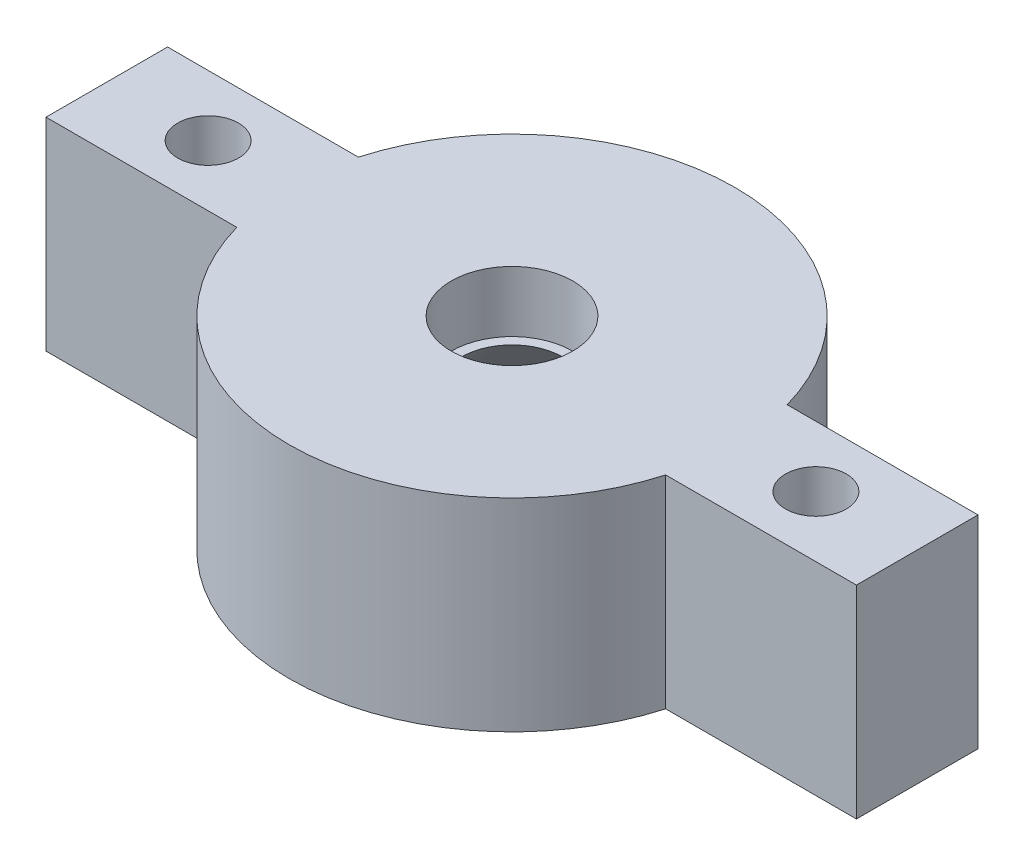
ISO-10303-21;
HEADER;
FILE_DESCRIPTION(('STEP AP214'),'2;1');
FILE_NAME('part.step','',(''),(''),'','','');
FILE_SCHEMA(('AUTOMOTIVE_DESIGN { 1 0 10303 214 1 1 1 1 }'));
ENDSEC;
DATA;
#1=APPLICATION_CONTEXT('core data for automotive mechanical design processes');
#2=APPLICATION_PROTOCOL_DEFINITION('international standard','automotive_design',2000,#1);
#3=PRODUCT_CONTEXT('',#1,'mechanical');
#4=PRODUCT('Part','Part','',(#3));
#5=PRODUCT_RELATED_PRODUCT_CATEGORY('part','',(#4));
#6=PRODUCT_DEFINITION_FORMATION('','',#4);
#7=PRODUCT_DEFINITION_CONTEXT('part definition',#1,'design');
#8=PRODUCT_DEFINITION('design','',#6,#7);
#9=PRODUCT_DEFINITION_SHAPE('','',#8);
#10=(LENGTH_UNIT() NAMED_UNIT(*) SI_UNIT(.MILLI.,.METRE.));
#11=(NAMED_UNIT(*) PLANE_ANGLE_UNIT() SI_UNIT($,.RADIAN.));
#12=(NAMED_UNIT(*) SI_UNIT($,.STERADIAN.) SOLID_ANGLE_UNIT());
#13=UNCERTAINTY_MEASURE_WITH_UNIT(LENGTH_MEASURE(1.E-05),#10,'distance_accuracy_value','');
#14=(GEOMETRIC_REPRESENTATION_CONTEXT(3) GLOBAL_UNCERTAINTY_ASSIGNED_CONTEXT((#13)) GLOBAL_UNIT_ASSIGNED_CONTEXT((#10,
#11,#12)) REPRESENTATION_CONTEXT('',''));
#15=CARTESIAN_POINT('',(0.,0.,0.));
#16=DIRECTION('',(0.,0.,1.));
#17=DIRECTION('',(1.,0.,0.));
#18=AXIS2_PLACEMENT_3D('',#15,#16,#17);
#19=CARTESIAN_POINT('',(40.,-5.,-3.));
#20=DIRECTION('',(0.,0.,1.));
#21=DIRECTION('',(1.,0.,0.));
#22=AXIS2_PLACEMENT_3D('',#19,#20,#21);
#23=PLANE('',#22);
#24=DIRECTION('',(-1.,0.,0.));
#25=VECTOR('',#24,1.);
#26=CARTESIAN_POINT('',(40.,-5.,-3.));
#27=LINE('',#26,#25);
#28=CARTESIAN_POINT('',(40.,-5.,-3.));
#29=VERTEX_POINT('',#28);
#30=CARTESIAN_POINT('',(30.5830052442584,-5.,-3.));
#31=VERTEX_POINT('',#30);
#32=EDGE_CURVE('E116',#29,#31,#27,.T.);
#33=ORIENTED_EDGE('',*,*,#32,.T.);
#34=DIRECTION('',(0.,1.,0.));
#35=VECTOR('',#34,1.);
#36=CARTESIAN_POINT('',(30.5830052442584,-36.1126983722081,-3.));
#37=LINE('',#36,#35);
#38=CARTESIAN_POINT('',(30.5830052442584,5.,-3.));
#39=VERTEX_POINT('',#38);
#40=EDGE_CURVE('E64',#31,#39,#37,.T.);
#41=ORIENTED_EDGE('',*,*,#40,.T.);
#42=DIRECTION('',(-1.,0.,0.));
#43=VECTOR('',#42,1.);
#44=CARTESIAN_POINT('',(40.,5.,-3.));
#45=LINE('',#44,#43);
#46=CARTESIAN_POINT('',(40.,5.,-3.));
#47=VERTEX_POINT('',#46);
#48=EDGE_CURVE('E49',#47,#39,#45,.T.);
#49=ORIENTED_EDGE('',*,*,#48,.F.);
#50=DIRECTION('',(0.,1.,0.));
#51=VECTOR('',#50,1.);
#52=CARTESIAN_POINT('',(40.,-5.,-3.));
#53=LINE('',#52,#51);
#54=EDGE_CURVE('E141',#29,#47,#53,.T.);
#55=ORIENTED_EDGE('',*,*,#54,.F.);
#56=EDGE_LOOP('',(#33,#41,#49,#55));
#57=FACE_BOUND('',#56,.T.);
#58=ADVANCED_FACE('F41',(#57),#23,.F.);
#59=CARTESIAN_POINT('',(40.,-5.,3.));
#60=DIRECTION('',(0.,0.,-1.));
#61=DIRECTION('',(-1.,0.,0.));
#62=AXIS2_PLACEMENT_3D('',#59,#60,#61);
#63=PLANE('',#62);
#64=DIRECTION('',(-1.,0.,0.));
#65=VECTOR('',#64,1.);
#66=CARTESIAN_POINT('',(40.,-5.,3.));
#67=LINE('',#66,#65);
#68=CARTESIAN_POINT('',(9.41699475574164,-5.,3.));
#69=VERTEX_POINT('',#68);
#70=CARTESIAN_POINT('',(0.,-5.,3.));
#71=VERTEX_POINT('',#70);
#72=EDGE_CURVE('E157',#69,#71,#67,.T.);
#73=ORIENTED_EDGE('',*,*,#72,.F.);
#74=DIRECTION('',(0.,1.,0.));
#75=VECTOR('',#74,1.);
#76=CARTESIAN_POINT('',(9.41699475574164,-36.1126983722081,3.));
#77=LINE('',#76,#75);
#78=CARTESIAN_POINT('',(9.41699475574164,5.,3.));
#79=VERTEX_POINT('',#78);
#80=EDGE_CURVE('E124',#69,#79,#77,.T.);
#81=ORIENTED_EDGE('',*,*,#80,.T.);
#82=DIRECTION('',(-1.,0.,0.));
#83=VECTOR('',#82,1.);
#84=CARTESIAN_POINT('',(40.,5.,3.));
#85=LINE('',#84,#83);
#86=CARTESIAN_POINT('',(0.,5.,3.));
#87=VERTEX_POINT('',#86);
#88=EDGE_CURVE('E161',#79,#87,#85,.T.);
#89=ORIENTED_EDGE('',*,*,#88,.T.);
#90=DIRECTION('',(0.,-1.,0.));
#91=VECTOR('',#90,1.);
#92=CARTESIAN_POINT('',(0.,-5.,3.));
#93=LINE('',#92,#91);
#94=EDGE_CURVE('E153',#87,#71,#93,.T.);
#95=ORIENTED_EDGE('',*,*,#94,.T.);
#96=EDGE_LOOP('',(#73,#81,#89,#95));
#97=FACE_BOUND('',#96,.T.);
#98=ADVANCED_FACE('F207',(#97),#63,.F.);
#99=CARTESIAN_POINT('',(9.41699475574164,5.,-3.));
#100=VERTEX_POINT('',#99);
#101=CARTESIAN_POINT('',(0.,5.,-3.));
#102=VERTEX_POINT('',#101);
#103=EDGE_CURVE('E56',#100,#102,#45,.T.);
#104=ORIENTED_EDGE('',*,*,#103,.F.);
#105=DIRECTION('',(0.,1.,0.));
#106=VECTOR('',#105,1.);
#107=CARTESIAN_POINT('',(9.41699475574164,-36.1126983722081,-3.));
#108=LINE('',#107,#106);
#109=CARTESIAN_POINT('',(9.41699475574164,-5.,-3.));
#110=VERTEX_POINT('',#109);
#111=EDGE_CURVE('E119',#100,#110,#108,.F.);
#112=ORIENTED_EDGE('',*,*,#111,.T.);
#113=CARTESIAN_POINT('',(0.,-5.,-3.));
#114=VERTEX_POINT('',#113);
#115=EDGE_CURVE('E108',#110,#114,#27,.T.);
#116=ORIENTED_EDGE('',*,*,#115,.T.);
#117=DIRECTION('',(0.,1.,0.));
#118=VECTOR('',#117,1.);
#119=CARTESIAN_POINT('',(0.,-5.,-3.));
#120=LINE('',#119,#118);
#121=EDGE_CURVE('E140',#114,#102,#120,.T.);
#122=ORIENTED_EDGE('',*,*,#121,.T.);
#123=EDGE_LOOP('',(#104,#112,#116,#122));
#124=FACE_BOUND('',#123,.T.);
#125=ADVANCED_FACE('F120',(#124),#23,.F.);
#126=CARTESIAN_POINT('',(40.,5.,3.));
#127=DIRECTION('',(0.,-1.,0.));
#128=DIRECTION('',(0.,0.,-1.));
#129=AXIS2_PLACEMENT_3D('',#126,#127,#128);
#130=PLANE('',#129);
#131=CARTESIAN_POINT('',(5.,5.,0.));
#132=DIRECTION('',(0.,-1.,0.));
#133=DIRECTION('',(0.,0.,-1.));
#134=AXIS2_PLACEMENT_3D('',#131,#132,#133);
#135=CIRCLE('',#134,1.5);
#136=CARTESIAN_POINT('',(5.,5.,-1.5));
#137=VERTEX_POINT('',#136);
#138=EDGE_CURVE('E175',#137,#137,#135,.F.);
#139=ORIENTED_EDGE('',*,*,#138,.F.);
#140=EDGE_LOOP('',(#139));
#141=FACE_BOUND('',#140,.T.);
#142=CARTESIAN_POINT('',(35.,5.,0.));
#143=DIRECTION('',(0.,-1.,0.));
#144=DIRECTION('',(0.,0.,-1.));
#145=AXIS2_PLACEMENT_3D('',#142,#143,#144);
#146=CIRCLE('',#145,1.49999999999999);
#147=CARTESIAN_POINT('',(35.,5.,-1.49999999999999));
#148=VERTEX_POINT('',#147);
#149=EDGE_CURVE('E428',#148,#148,#146,.F.);
#150=ORIENTED_EDGE('',*,*,#149,.F.);
#151=EDGE_LOOP('',(#150));
#152=FACE_BOUND('',#151,.T.);
#153=CARTESIAN_POINT('',(20.,5.,0.));
#154=DIRECTION('',(0.,-1.,0.));
#155=DIRECTION('',(0.,0.,-1.));
#156=AXIS2_PLACEMENT_3D('',#153,#154,#155);
#157=CIRCLE('',#156,3.);
#158=CARTESIAN_POINT('',(20.,5.,-3.));
#159=VERTEX_POINT('',#158);
#160=EDGE_CURVE('E165',#159,#159,#157,.T.);
#161=ORIENTED_EDGE('',*,*,#160,.T.);
#162=EDGE_LOOP('',(#161));
#163=FACE_BOUND('',#162,.T.);
#164=ORIENTED_EDGE('',*,*,#88,.F.);
#165=CARTESIAN_POINT('',(20.,5.,0.));
#166=DIRECTION('',(0.,1.,0.));
#167=DIRECTION('',(0.,0.,1.));
#168=AXIS2_PLACEMENT_3D('',#165,#166,#167);
#169=CIRCLE('',#168,11.);
#170=CARTESIAN_POINT('',(30.5830052442584,5.,3.));
#171=VERTEX_POINT('',#170);
#172=EDGE_CURVE('E134',#79,#171,#169,.T.);
#173=ORIENTED_EDGE('',*,*,#172,.T.);
#174=CARTESIAN_POINT('',(40.,5.,3.));
#175=VERTEX_POINT('',#174);
#176=EDGE_CURVE('E162',#175,#171,#85,.T.);
#177=ORIENTED_EDGE('',*,*,#176,.F.);
#178=DIRECTION('',(0.,0.,1.));
#179=VECTOR('',#178,1.);
#180=CARTESIAN_POINT('',(40.,5.,3.));
#181=LINE('',#180,#179);
#182=EDGE_CURVE('E144',#47,#175,#181,.T.);
#183=ORIENTED_EDGE('',*,*,#182,.F.);
#184=ORIENTED_EDGE('',*,*,#48,.T.);
#185=EDGE_CURVE('E132',#39,#100,#169,.T.);
#186=ORIENTED_EDGE('',*,*,#185,.T.);
#187=ORIENTED_EDGE('',*,*,#103,.T.);
#188=DIRECTION('',(0.,0.,1.));
#189=VECTOR('',#188,1.);
#190=CARTESIAN_POINT('',(0.,5.,3.));
#191=LINE('',#190,#189);
#192=EDGE_CURVE('E150',#102,#87,#191,.T.);
#193=ORIENTED_EDGE('',*,*,#192,.T.);
#194=EDGE_LOOP('',(#164,#173,#177,#183,#184,#186,#187,#193));
#195=FACE_BOUND('',#194,.T.);
#196=ADVANCED_FACE('F192',(#141,#152,#163,#195),#130,.F.);
#197=ORIENTED_EDGE('',*,*,#176,.T.);
#198=DIRECTION('',(0.,1.,0.));
#199=VECTOR('',#198,1.);
#200=CARTESIAN_POINT('',(30.5830052442584,-36.1126983722081,3.));
#201=LINE('',#200,#199);
#202=CARTESIAN_POINT('',(30.5830052442584,-5.,3.));
#203=VERTEX_POINT('',#202);
#204=EDGE_CURVE('E127',#171,#203,#201,.F.);
#205=ORIENTED_EDGE('',*,*,#204,.T.);
#206=CARTESIAN_POINT('',(40.,-5.,3.));
#207=VERTEX_POINT('',#206);
#208=EDGE_CURVE('E158',#207,#203,#67,.T.);
#209=ORIENTED_EDGE('',*,*,#208,.F.);
#210=DIRECTION('',(0.,-1.,0.));
#211=VECTOR('',#210,1.);
#212=CARTESIAN_POINT('',(40.,-5.,3.));
#213=LINE('',#212,#211);
#214=EDGE_CURVE('E146',#175,#207,#213,.T.);
#215=ORIENTED_EDGE('',*,*,#214,.F.);
#216=EDGE_LOOP('',(#197,#205,#209,#215));
#217=FACE_BOUND('',#216,.T.);
#218=ADVANCED_FACE('F202',(#217),#63,.F.);
#219=CARTESIAN_POINT('',(40.,-5.,3.));
#220=DIRECTION('',(0.,1.,0.));
#221=DIRECTION('',(0.,0.,1.));
#222=AXIS2_PLACEMENT_3D('',#219,#220,#221);
#223=PLANE('',#222);
#224=CARTESIAN_POINT('',(5.,-5.,0.));
#225=DIRECTION('',(0.,-1.,0.));
#226=DIRECTION('',(0.,0.,-1.));
#227=AXIS2_PLACEMENT_3D('',#224,#225,#226);
#228=CIRCLE('',#227,1.5);
#229=CARTESIAN_POINT('',(5.,-5.,-1.5));
#230=VERTEX_POINT('',#229);
#231=EDGE_CURVE('E180',#230,#230,#228,.T.);
#232=ORIENTED_EDGE('',*,*,#231,.F.);
#233=EDGE_LOOP('',(#232));
#234=FACE_BOUND('',#233,.T.);
#235=CARTESIAN_POINT('',(35.,-5.,0.));
#236=DIRECTION('',(0.,-1.,0.));
#237=DIRECTION('',(0.,0.,1.));
#238=AXIS2_PLACEMENT_3D('',#235,#236,#237);
#239=CIRCLE('',#238,1.49999999999999);
#240=CARTESIAN_POINT('',(35.,-5.,1.49999999999999));
#241=VERTEX_POINT('',#240);
#242=EDGE_CURVE('E183',#241,#241,#239,.T.);
#243=ORIENTED_EDGE('',*,*,#242,.F.);
#244=EDGE_LOOP('',(#243));
#245=FACE_BOUND('',#244,.T.);
#246=CARTESIAN_POINT('',(20.,-5.,0.));
#247=DIRECTION('',(0.,1.,0.));
#248=DIRECTION('',(0.,0.,1.));
#249=AXIS2_PLACEMENT_3D('',#246,#247,#248);
#250=CIRCLE('',#249,9.5);
#251=CARTESIAN_POINT('',(20.,-5.,9.5));
#252=VERTEX_POINT('',#251);
#253=EDGE_CURVE('E12',#252,#252,#250,.T.);
#254=ORIENTED_EDGE('',*,*,#253,.T.);
#255=EDGE_LOOP('',(#254));
#256=FACE_BOUND('',#255,.T.);
#257=ORIENTED_EDGE('',*,*,#115,.F.);
#258=CARTESIAN_POINT('',(20.,-5.,0.));
#259=DIRECTION('',(0.,1.,0.));
#260=DIRECTION('',(0.,0.,1.));
#261=AXIS2_PLACEMENT_3D('',#258,#259,#260);
#262=CIRCLE('',#261,11.);
#263=EDGE_CURVE('E112',#110,#31,#262,.F.);
#264=ORIENTED_EDGE('',*,*,#263,.T.);
#265=ORIENTED_EDGE('',*,*,#32,.F.);
#266=DIRECTION('',(0.,0.,-1.));
#267=VECTOR('',#266,1.);
#268=CARTESIAN_POINT('',(40.,-5.,3.));
#269=LINE('',#268,#267);
#270=EDGE_CURVE('E117',#207,#29,#269,.T.);
#271=ORIENTED_EDGE('',*,*,#270,.F.);
#272=ORIENTED_EDGE('',*,*,#208,.T.);
#273=EDGE_CURVE('E128',#203,#69,#262,.F.);
#274=ORIENTED_EDGE('',*,*,#273,.T.);
#275=ORIENTED_EDGE('',*,*,#72,.T.);
#276=DIRECTION('',(0.,0.,-1.));
#277=VECTOR('',#276,1.);
#278=CARTESIAN_POINT('',(0.,-5.,3.));
#279=LINE('',#278,#277);
#280=EDGE_CURVE('E114',#71,#114,#279,.T.);
#281=ORIENTED_EDGE('',*,*,#280,.T.);
#282=EDGE_LOOP('',(#257,#264,#265,#271,#272,#274,#275,#281));
#283=FACE_BOUND('',#282,.T.);
#284=ADVANCED_FACE('F109',(#234,#245,#256,#283),#223,.F.);
#285=CARTESIAN_POINT('',(40.,0.,0.));
#286=DIRECTION('',(-1.,0.,0.));
#287=DIRECTION('',(0.,0.,1.));
#288=AXIS2_PLACEMENT_3D('',#285,#286,#287);
#289=PLANE('',#288);
#290=ORIENTED_EDGE('',*,*,#54,.T.);
#291=ORIENTED_EDGE('',*,*,#182,.T.);
#292=ORIENTED_EDGE('',*,*,#214,.T.);
#293=ORIENTED_EDGE('',*,*,#270,.T.);
#294=EDGE_LOOP('',(#290,#291,#292,#293));
#295=FACE_BOUND('',#294,.T.);
#296=ADVANCED_FACE('F196',(#295),#289,.F.);
#297=CARTESIAN_POINT('',(0.,0.,0.));
#298=DIRECTION('',(-1.,0.,0.));
#299=DIRECTION('',(0.,0.,1.));
#300=AXIS2_PLACEMENT_3D('',#297,#298,#299);
#301=PLANE('',#300);
#302=ORIENTED_EDGE('',*,*,#121,.F.);
#303=ORIENTED_EDGE('',*,*,#280,.F.);
#304=ORIENTED_EDGE('',*,*,#94,.F.);
#305=ORIENTED_EDGE('',*,*,#192,.F.);
#306=EDGE_LOOP('',(#302,#303,#304,#305));
#307=FACE_BOUND('',#306,.T.);
#308=ADVANCED_FACE('F210',(#307),#301,.T.);
#309=CARTESIAN_POINT('',(20.,-36.1126983722081,0.));
#310=DIRECTION('',(0.,1.,0.));
#311=DIRECTION('',(0.,0.,1.));
#312=AXIS2_PLACEMENT_3D('',#309,#310,#311);
#313=CYLINDRICAL_SURFACE('',#312,11.);
#314=ORIENTED_EDGE('',*,*,#80,.F.);
#315=ORIENTED_EDGE('',*,*,#273,.F.);
#316=ORIENTED_EDGE('',*,*,#204,.F.);
#317=ORIENTED_EDGE('',*,*,#172,.F.);
#318=EDGE_LOOP('',(#314,#315,#316,#317));
#319=FACE_BOUND('',#318,.T.);
#320=ADVANCED_FACE('F204',(#319),#313,.T.);
#321=ORIENTED_EDGE('',*,*,#40,.F.);
#322=ORIENTED_EDGE('',*,*,#263,.F.);
#323=ORIENTED_EDGE('',*,*,#111,.F.);
#324=ORIENTED_EDGE('',*,*,#185,.F.);
#325=EDGE_LOOP('',(#321,#322,#323,#324));
#326=FACE_BOUND('',#325,.T.);
#327=ADVANCED_FACE('F126',(#326),#313,.T.);
#328=CARTESIAN_POINT('',(20.,2.,0.));
#329=DIRECTION('',(0.,-1.,0.));
#330=DIRECTION('',(0.,0.,-1.));
#331=AXIS2_PLACEMENT_3D('',#328,#329,#330);
#332=CONICAL_SURFACE('',#331,2.5,0.785398163397448);
#333=CARTESIAN_POINT('',(20.,-3.00000000000001,0.));
#334=DIRECTION('',(0.,1.,0.));
#335=DIRECTION('',(0.,0.,1.));
#336=AXIS2_PLACEMENT_3D('',#333,#334,#335);
#337=CIRCLE('',#336,7.5);
#338=CARTESIAN_POINT('',(20.,-3.00000000000001,-7.5));
#339=VERTEX_POINT('',#338);
#340=EDGE_CURVE('E172',#339,#339,#337,.T.);
#341=CARTESIAN_POINT('',(20.,2.,0.));
#342=DIRECTION('',(0.,1.,0.));
#343=DIRECTION('',(0.,0.,1.));
#344=AXIS2_PLACEMENT_3D('',#341,#342,#343);
#345=CIRCLE('',#344,2.5);
#346=CARTESIAN_POINT('',(20.,2.,-2.5));
#347=VERTEX_POINT('',#346);
#348=EDGE_CURVE('E167',#347,#347,#345,.T.);
#349=CARTESIAN_POINT('',(20.,-3.00000000000001,-7.5));
#350=CARTESIAN_POINT('',(20.,-2.94791666666667,-7.44791666666666));
#351=CARTESIAN_POINT('',(20.,-2.89583333333334,-7.39583333333333));
#352=CARTESIAN_POINT('',(20.,-2.79166666666667,-7.29166666666666));
#353=CARTESIAN_POINT('',(20.,-2.73958333333334,-7.23958333333333));
#354=CARTESIAN_POINT('',(20.,-2.63541666666667,-7.13541666666666));
#355=CARTESIAN_POINT('',(20.,-2.58333333333334,-7.08333333333333));
#356=CARTESIAN_POINT('',(20.,-2.47916666666667,-6.97916666666666));
#357=CARTESIAN_POINT('',(20.,-2.42708333333334,-6.92708333333333));
#358=CARTESIAN_POINT('',(20.,-2.32291666666667,-6.82291666666666));
#359=CARTESIAN_POINT('',(20.,-2.27083333333334,-6.77083333333333));
#360=CARTESIAN_POINT('',(20.,-2.16666666666667,-6.66666666666666));
#361=CARTESIAN_POINT('',(20.,-2.11458333333334,-6.61458333333333));
#362=CARTESIAN_POINT('',(20.,-2.01041666666667,-6.51041666666666));
#363=CARTESIAN_POINT('',(20.,-1.95833333333334,-6.45833333333333));
#364=CARTESIAN_POINT('',(20.,-1.85416666666667,-6.35416666666666));
#365=CARTESIAN_POINT('',(20.,-1.80208333333334,-6.30208333333333));
#366=CARTESIAN_POINT('',(20.,-1.69791666666667,-6.19791666666666));
#367=CARTESIAN_POINT('',(20.,-1.64583333333334,-6.14583333333333));
#368=CARTESIAN_POINT('',(20.,-1.54166666666667,-6.04166666666666));
#369=CARTESIAN_POINT('',(20.,-1.48958333333334,-5.98958333333333));
#370=CARTESIAN_POINT('',(20.,-1.38541666666667,-5.88541666666666));
#371=CARTESIAN_POINT('',(20.,-1.33333333333334,-5.83333333333333));
#372=CARTESIAN_POINT('',(20.,-1.22916666666667,-5.72916666666666));
#373=CARTESIAN_POINT('',(20.,-1.17708333333334,-5.67708333333333));
#374=CARTESIAN_POINT('',(20.,-1.07291666666667,-5.57291666666666));
#375=CARTESIAN_POINT('',(20.,-1.02083333333334,-5.52083333333333));
#376=CARTESIAN_POINT('',(20.,-0.916666666666672,-5.41666666666666));
#377=CARTESIAN_POINT('',(20.,-0.864583333333338,-5.36458333333333));
#378=CARTESIAN_POINT('',(20.,-0.760416666666672,-5.26041666666666));
#379=CARTESIAN_POINT('',(20.,-0.708333333333338,-5.20833333333333));
#380=CARTESIAN_POINT('',(20.,-0.604166666666672,-5.10416666666666));
#381=CARTESIAN_POINT('',(20.,-0.552083333333338,-5.05208333333333));
#382=CARTESIAN_POINT('',(20.,-0.447916666666671,-4.94791666666666));
#383=CARTESIAN_POINT('',(20.,-0.395833333333338,-4.89583333333333));
#384=CARTESIAN_POINT('',(20.,-0.291666666666671,-4.79166666666666));
#385=CARTESIAN_POINT('',(20.,-0.239583333333338,-4.73958333333333));
#386=CARTESIAN_POINT('',(20.,-0.135416666666671,-4.63541666666666));
#387=CARTESIAN_POINT('',(20.,-0.0833333333333381,-4.58333333333333));
#388=CARTESIAN_POINT('',(20.,0.0208333333333285,-4.47916666666666));
#389=CARTESIAN_POINT('',(20.,0.072916666666662,-4.42708333333333));
#390=CARTESIAN_POINT('',(20.,0.177083333333329,-4.32291666666666));
#391=CARTESIAN_POINT('',(20.,0.229166666666662,-4.27083333333333));
#392=CARTESIAN_POINT('',(20.,0.333333333333329,-4.16666666666667));
#393=CARTESIAN_POINT('',(20.,0.385416666666662,-4.11458333333333));
#394=CARTESIAN_POINT('',(20.,0.489583333333329,-4.01041666666666));
#395=CARTESIAN_POINT('',(20.,0.541666666666662,-3.95833333333333));
#396=CARTESIAN_POINT('',(20.,0.645833333333329,-3.85416666666667));
#397=CARTESIAN_POINT('',(20.,0.697916666666662,-3.80208333333333));
#398=CARTESIAN_POINT('',(20.,0.802083333333329,-3.69791666666666));
#399=CARTESIAN_POINT('',(20.,0.854166666666662,-3.64583333333333));
#400=CARTESIAN_POINT('',(20.,0.958333333333329,-3.54166666666666));
#401=CARTESIAN_POINT('',(20.,1.01041666666666,-3.48958333333333));
#402=CARTESIAN_POINT('',(20.,1.11458333333333,-3.38541666666666));
#403=CARTESIAN_POINT('',(20.,1.16666666666666,-3.33333333333333));
#404=CARTESIAN_POINT('',(20.,1.27083333333333,-3.22916666666666));
#405=CARTESIAN_POINT('',(20.,1.32291666666666,-3.17708333333333));
#406=CARTESIAN_POINT('',(20.,1.42708333333333,-3.07291666666667));
#407=CARTESIAN_POINT('',(20.,1.47916666666666,-3.02083333333333));
#408=CARTESIAN_POINT('',(20.,1.58333333333333,-2.91666666666667));
#409=CARTESIAN_POINT('',(20.,1.63541666666666,-2.86458333333333));
#410=CARTESIAN_POINT('',(20.,1.73958333333333,-2.76041666666667));
#411=CARTESIAN_POINT('',(20.,1.79166666666666,-2.70833333333333));
#412=CARTESIAN_POINT('',(20.,1.89583333333333,-2.60416666666667));
#413=CARTESIAN_POINT('',(20.,1.94791666666666,-2.55208333333333));
#414=CARTESIAN_POINT('',(20.,2.,-2.5));
#415=B_SPLINE_CURVE_WITH_KNOTS('',3,(#349,#350,#351,#352,#353,#354,#355,#356,#357,#358,#359,
#360,#361,#362,#363,#364,#365,#366,#367,#368,#369,#370,#371,#372,#373,#374,#375,#376,#377,#378,
#379,#380,#381,#382,#383,#384,#385,#386,#387,#388,#389,#390,#391,#392,#393,#394,#395,#396,#397,
#398,#399,#400,#401,#402,#403,#404,#405,#406,#407,#408,#409,#410,#411,#412,#413,#414),
.UNSPECIFIED.,.F.,.F.,(4,2,2,2,2,2,2,2,2,2,2,2,2,2,2,2,2,2,2,2,2,2,2,2,2,2,2,2,2,2,2,2,4),(0.,
0.220970869120796,0.441941738241593,0.662912607362389,0.883883476483185,1.10485434560398,
1.32582521472478,1.54679608384557,1.76776695296637,1.98873782208716,2.20970869120796,
2.43067956032876,2.65165042944955,2.87262129857035,3.09359216769114,3.31456303681194,
3.53553390593274,3.75650477505353,3.97747564417433,4.19844651329513,4.41941738241592,
4.64038825153672,4.86135912065751,5.08232998977831,5.3033008588991,5.5242717280199,
5.7452425971407,5.96621346626149,6.18718433538229,6.40815520450308,6.62912607362388,
6.85009694274468,7.07106781186547),.UNSPECIFIED.);
#416=EDGE_CURVE('BSEAM263',#339,#347,#415,.T.);
#417=ORIENTED_EDGE('',*,*,#340,.F.);
#418=ORIENTED_EDGE('',*,*,#348,.T.);
#419=ORIENTED_EDGE('',*,*,#416,.T.);
#420=ORIENTED_EDGE('',*,*,#416,.F.);
#421=EDGE_LOOP('',(#417,#419,#418,#420));
#422=FACE_BOUND('',#421,.T.);
#423=ADVANCED_FACE('F263',(#422),#332,.F.);
#424=CARTESIAN_POINT('',(20.,2.,0.));
#425=DIRECTION('',(0.,-1.,0.));
#426=DIRECTION('',(0.,0.,-1.));
#427=AXIS2_PLACEMENT_3D('',#424,#425,#426);
#428=PLANE('',#427);
#429=CARTESIAN_POINT('',(20.,2.,0.));
#430=DIRECTION('',(0.,-1.,0.));
#431=DIRECTION('',(0.,0.,-1.));
#432=AXIS2_PLACEMENT_3D('',#429,#430,#431);
#433=CIRCLE('',#432,3.);
#434=CARTESIAN_POINT('',(20.,2.,-3.));
#435=VERTEX_POINT('',#434);
#436=EDGE_CURVE('E168',#435,#435,#433,.T.);
#437=ORIENTED_EDGE('',*,*,#436,.F.);
#438=EDGE_LOOP('',(#437));
#439=FACE_BOUND('',#438,.T.);
#440=ORIENTED_EDGE('',*,*,#348,.F.);
#441=EDGE_LOOP('',(#440));
#442=FACE_BOUND('',#441,.T.);
#443=ADVANCED_FACE('F258',(#439,#442),#428,.F.);
#444=CARTESIAN_POINT('',(20.,15.,0.));
#445=DIRECTION('',(0.,-1.,0.));
#446=DIRECTION('',(0.,0.,-1.));
#447=AXIS2_PLACEMENT_3D('',#444,#445,#446);
#448=CYLINDRICAL_SURFACE('',#447,3.);
#449=CARTESIAN_POINT('',(20.,2.,-3.));
#450=CARTESIAN_POINT('',(20.,2.03125,-3.));
#451=CARTESIAN_POINT('',(20.,2.0625,-3.));
#452=CARTESIAN_POINT('',(20.,2.125,-3.));
#453=CARTESIAN_POINT('',(20.,2.15625,-3.));
#454=CARTESIAN_POINT('',(20.,2.21875,-3.));
#455=CARTESIAN_POINT('',(20.,2.25,-3.));
#456=CARTESIAN_POINT('',(20.,2.3125,-3.));
#457=CARTESIAN_POINT('',(20.,2.34375,-3.));
#458=CARTESIAN_POINT('',(20.,2.40625,-3.));
#459=CARTESIAN_POINT('',(20.,2.4375,-3.));
#460=CARTESIAN_POINT('',(20.,2.5,-3.));
#461=CARTESIAN_POINT('',(20.,2.53125,-3.));
#462=CARTESIAN_POINT('',(20.,2.59375,-3.));
#463=CARTESIAN_POINT('',(20.,2.625,-3.));
#464=CARTESIAN_POINT('',(20.,2.6875,-3.));
#465=CARTESIAN_POINT('',(20.,2.71875,-3.));
#466=CARTESIAN_POINT('',(20.,2.78125,-3.));
#467=CARTESIAN_POINT('',(20.,2.8125,-3.));
#468=CARTESIAN_POINT('',(20.,2.875,-3.));
#469=CARTESIAN_POINT('',(20.,2.90625,-3.));
#470=CARTESIAN_POINT('',(20.,2.96875,-3.));
#471=CARTESIAN_POINT('',(20.,3.,-3.));
#472=CARTESIAN_POINT('',(20.,3.0625,-3.));
#473=CARTESIAN_POINT('',(20.,3.09375,-3.));
#474=CARTESIAN_POINT('',(20.,3.15625,-3.));
#475=CARTESIAN_POINT('',(20.,3.1875,-3.));
#476=CARTESIAN_POINT('',(20.,3.25,-3.));
#477=CARTESIAN_POINT('',(20.,3.28125,-3.));
#478=CARTESIAN_POINT('',(20.,3.34375,-3.));
#479=CARTESIAN_POINT('',(20.,3.375,-3.));
#480=CARTESIAN_POINT('',(20.,3.4375,-3.));
#481=CARTESIAN_POINT('',(20.,3.46875,-3.));
#482=CARTESIAN_POINT('',(20.,3.53125,-3.));
#483=CARTESIAN_POINT('',(20.,3.5625,-3.));
#484=CARTESIAN_POINT('',(20.,3.625,-3.));
#485=CARTESIAN_POINT('',(20.,3.65625,-3.));
#486=CARTESIAN_POINT('',(20.,3.71875,-3.));
#487=CARTESIAN_POINT('',(20.,3.75,-3.));
#488=CARTESIAN_POINT('',(20.,3.8125,-3.));
#489=CARTESIAN_POINT('',(20.,3.84375,-3.));
#490=CARTESIAN_POINT('',(20.,3.90625,-3.));
#491=CARTESIAN_POINT('',(20.,3.9375,-3.));
#492=CARTESIAN_POINT('',(20.,4.,-3.));
#493=CARTESIAN_POINT('',(20.,4.03125,-3.));
#494=CARTESIAN_POINT('',(20.,4.09375,-3.));
#495=CARTESIAN_POINT('',(20.,4.125,-3.));
#496=CARTESIAN_POINT('',(20.,4.1875,-3.));
#497=CARTESIAN_POINT('',(20.,4.21875,-3.));
#498=CARTESIAN_POINT('',(20.,4.28125,-3.));
#499=CARTESIAN_POINT('',(20.,4.3125,-3.));
#500=CARTESIAN_POINT('',(20.,4.375,-3.));
#501=CARTESIAN_POINT('',(20.,4.40625,-3.));
#502=CARTESIAN_POINT('',(20.,4.46875,-3.));
#503=CARTESIAN_POINT('',(20.,4.5,-3.));
#504=CARTESIAN_POINT('',(20.,4.5625,-3.));
#505=CARTESIAN_POINT('',(20.,4.59375,-3.));
#506=CARTESIAN_POINT('',(20.,4.65625,-3.));
#507=CARTESIAN_POINT('',(20.,4.6875,-3.));
#508=CARTESIAN_POINT('',(20.,4.75,-3.));
#509=CARTESIAN_POINT('',(20.,4.78125,-3.));
#510=CARTESIAN_POINT('',(20.,4.84375,-3.));
#511=CARTESIAN_POINT('',(20.,4.875,-3.));
#512=CARTESIAN_POINT('',(20.,4.9375,-3.));
#513=CARTESIAN_POINT('',(20.,4.96875,-3.));
#514=CARTESIAN_POINT('',(20.,5.,-3.));
#515=B_SPLINE_CURVE_WITH_KNOTS('',3,(#449,#450,#451,#452,#453,#454,#455,#456,#457,#458,#459,
#460,#461,#462,#463,#464,#465,#466,#467,#468,#469,#470,#471,#472,#473,#474,#475,#476,#477,#478,
#479,#480,#481,#482,#483,#484,#485,#486,#487,#488,#489,#490,#491,#492,#493,#494,#495,#496,#497,
#498,#499,#500,#501,#502,#503,#504,#505,#506,#507,#508,#509,#510,#511,#512,#513,#514),
.UNSPECIFIED.,.F.,.F.,(4,2,2,2,2,2,2,2,2,2,2,2,2,2,2,2,2,2,2,2,2,2,2,2,2,2,2,2,2,2,2,2,4),(0.,
0.0937500000000001,0.1875,0.28125,0.375,0.46875,0.5625,0.656250000000001,0.750000000000001,
0.843750000000001,0.937500000000001,1.03125,1.125,1.21875,1.3125,1.40625,1.5,1.59375,1.6875,
1.78125,1.875,1.96875,2.0625,2.15625,2.25,2.34375,2.4375,2.53125,2.625,2.71875,2.8125,2.90625,
3.),.UNSPECIFIED.);
#516=EDGE_CURVE('BSEAM250',#435,#159,#515,.T.);
#517=ORIENTED_EDGE('',*,*,#436,.T.);
#518=ORIENTED_EDGE('',*,*,#160,.F.);
#519=ORIENTED_EDGE('',*,*,#516,.T.);
#520=ORIENTED_EDGE('',*,*,#516,.F.);
#521=EDGE_LOOP('',(#517,#519,#518,#520));
#522=FACE_BOUND('',#521,.T.);
#523=ADVANCED_FACE('F250',(#522),#448,.F.);
#524=CARTESIAN_POINT('',(20.,-3.,0.));
#525=DIRECTION('',(0.,1.,0.));
#526=DIRECTION('',(0.,0.,1.));
#527=AXIS2_PLACEMENT_3D('',#524,#525,#526);
#528=TOROIDAL_SURFACE('',#527,9.5,2.);
#529=ORIENTED_EDGE('',*,*,#253,.F.);
#530=EDGE_LOOP('',(#529));
#531=FACE_BOUND('',#530,.T.);
#532=ORIENTED_EDGE('',*,*,#340,.T.);
#533=EDGE_LOOP('',(#532));
#534=FACE_BOUND('',#533,.T.);
#535=ADVANCED_FACE('F43',(#531,#534),#528,.T.);
#536=CARTESIAN_POINT('',(35.,5.001,0.));
#537=DIRECTION('',(0.,-1.,0.));
#538=DIRECTION('',(0.,0.,-1.));
#539=AXIS2_PLACEMENT_3D('',#536,#537,#538);
#540=CYLINDRICAL_SURFACE('',#539,1.49999999999999);
#541=ORIENTED_EDGE('',*,*,#242,.T.);
#542=EDGE_LOOP('',(#541));
#543=FACE_BOUND('',#542,.T.);
#544=ORIENTED_EDGE('',*,*,#149,.T.);
#545=EDGE_LOOP('',(#544));
#546=FACE_BOUND('',#545,.T.);
#547=ADVANCED_FACE('F249',(#543,#546),#540,.F.);
#548=CARTESIAN_POINT('',(5.,5.001,0.));
#549=DIRECTION('',(0.,-1.,0.));
#550=DIRECTION('',(0.,0.,-1.));
#551=AXIS2_PLACEMENT_3D('',#548,#549,#550);
#552=CYLINDRICAL_SURFACE('',#551,1.5);
#553=ORIENTED_EDGE('',*,*,#231,.T.);
#554=EDGE_LOOP('',(#553));
#555=FACE_BOUND('',#554,.T.);
#556=ORIENTED_EDGE('',*,*,#138,.T.);
#557=EDGE_LOOP('',(#556));
#558=FACE_BOUND('',#557,.T.);
#559=ADVANCED_FACE('F255',(#555,#558),#552,.F.);
#560=CLOSED_SHELL('',(#58,#98,#125,#196,#218,#284,#296,#308,#320,#327,#423,#443,#523,#535,#547,#559));
#561=MANIFOLD_SOLID_BREP('B2',#560);
#562=ADVANCED_BREP_SHAPE_REPRESENTATION('',(#18,#561),#14);
#563=SHAPE_DEFINITION_REPRESENTATION(#9,#562);
ENDSEC;
END-ISO-10303-21;
